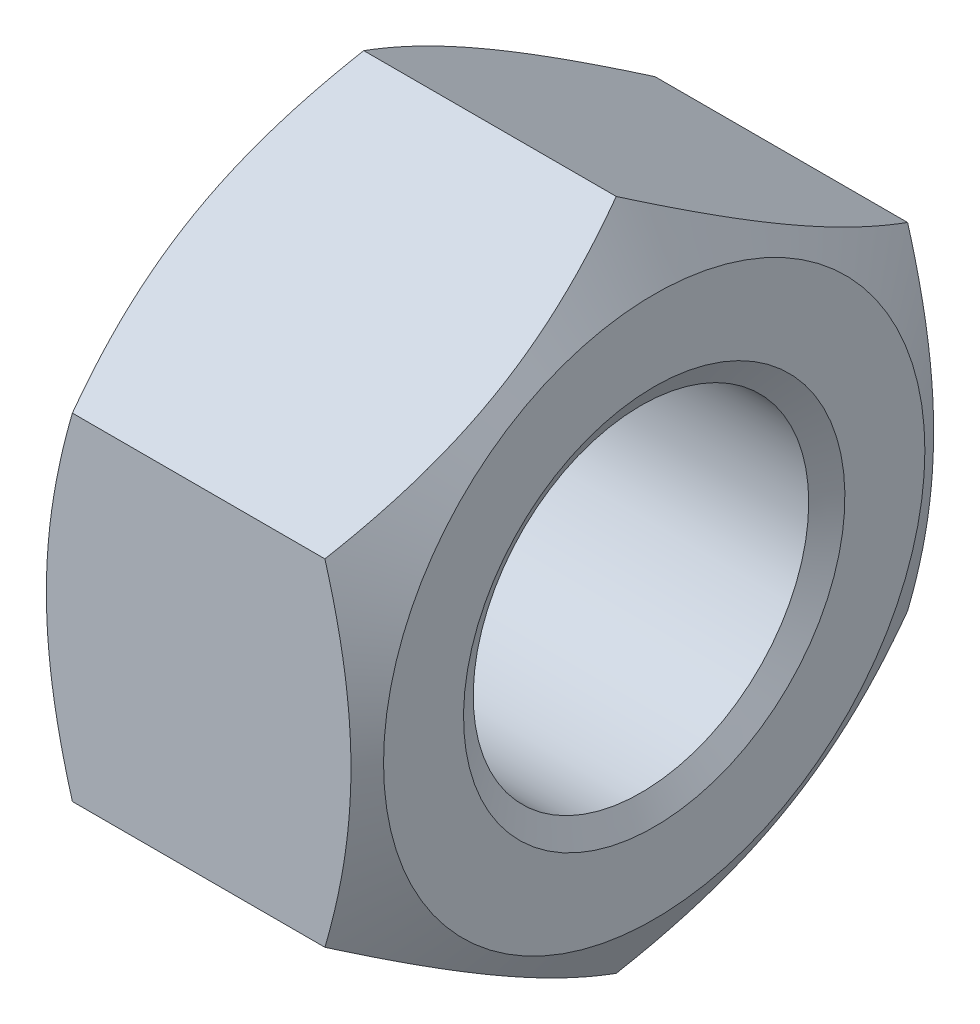
ISO-10303-21;
HEADER;
FILE_DESCRIPTION(('STEP AP214'),'2;1');
FILE_NAME('part.step','',(''),(''),'','','');
FILE_SCHEMA(('AUTOMOTIVE_DESIGN { 1 0 10303 214 1 1 1 1 }'));
ENDSEC;
DATA;
#1=APPLICATION_CONTEXT('core data for automotive mechanical design processes');
#2=APPLICATION_PROTOCOL_DEFINITION('international standard','automotive_design',2000,#1);
#3=PRODUCT_CONTEXT('',#1,'mechanical');
#4=PRODUCT('Part','Part','',(#3));
#5=PRODUCT_RELATED_PRODUCT_CATEGORY('part','',(#4));
#6=PRODUCT_DEFINITION_FORMATION('','',#4);
#7=PRODUCT_DEFINITION_CONTEXT('part definition',#1,'design');
#8=PRODUCT_DEFINITION('design','',#6,#7);
#9=PRODUCT_DEFINITION_SHAPE('','',#8);
#10=(LENGTH_UNIT() NAMED_UNIT(*) SI_UNIT(.MILLI.,.METRE.));
#11=(NAMED_UNIT(*) PLANE_ANGLE_UNIT() SI_UNIT($,.RADIAN.));
#12=(NAMED_UNIT(*) SI_UNIT($,.STERADIAN.) SOLID_ANGLE_UNIT());
#13=UNCERTAINTY_MEASURE_WITH_UNIT(LENGTH_MEASURE(1.E-05),#10,'distance_accuracy_value','');
#14=(GEOMETRIC_REPRESENTATION_CONTEXT(3) GLOBAL_UNCERTAINTY_ASSIGNED_CONTEXT((#13)) GLOBAL_UNIT_ASSIGNED_CONTEXT((#10,
#11,#12)) REPRESENTATION_CONTEXT('',''));
#15=CARTESIAN_POINT('',(0.,0.,0.));
#16=DIRECTION('',(0.,0.,1.));
#17=DIRECTION('',(1.,0.,0.));
#18=AXIS2_PLACEMENT_3D('',#15,#16,#17);
#19=CARTESIAN_POINT('',(0.,-15.8771324027147,27.5));
#20=DIRECTION('',(0.,0.,1.));
#21=DIRECTION('',(1.,0.,0.));
#22=AXIS2_PLACEMENT_3D('',#19,#20,#21);
#23=PLANE('',#22);
#24=CARTESIAN_POINT('',(27.4179660081602,15.8771324283283,27.4999999634062));
#25=CARTESIAN_POINT('',(27.6194275084082,15.1791897354773,27.4999999868555));
#26=CARTESIAN_POINT('',(27.8117467023488,14.4785246937009,27.4999999964772));
#27=CARTESIAN_POINT('',(28.1755593037495,13.0715761437403,27.500000003524));
#28=CARTESIAN_POINT('',(28.3470458616822,12.3652908685772,27.5000000009452));
#29=CARTESIAN_POINT('',(28.6668913975676,10.9457218913568,27.4999999990526));
#30=CARTESIAN_POINT('',(28.8151951481019,10.232425654135,27.4999999997464));
#31=CARTESIAN_POINT('',(29.0854802550406,8.80090717764845,27.5000000002536));
#32=CARTESIAN_POINT('',(29.207464233653,8.08268543646892,27.5000000000672));
#33=CARTESIAN_POINT('',(29.4199317976802,6.65967402289102,27.4999999999345));
#34=CARTESIAN_POINT('',(29.5111180260964,5.95498989794372,27.4999999999825));
#35=CARTESIAN_POINT('',(29.6640153971568,4.54239286358087,27.5000000000176));
#36=CARTESIAN_POINT('',(29.7257259723969,3.83447989227508,27.5000000000047));
#37=CARTESIAN_POINT('',(29.8181138792253,2.41746490997051,27.4999999999953));
#38=CARTESIAN_POINT('',(29.8488280858768,1.7083653194658,27.4999999999988));
#39=CARTESIAN_POINT('',(29.8785627618416,0.289511919389594,27.5000000000013));
#40=CARTESIAN_POINT('',(29.8775842106332,-0.420241869285694,27.5000000000003));
#41=CARTESIAN_POINT('',(29.8461478799588,-1.74712024493427,27.4999999999997));
#42=CARTESIAN_POINT('',(29.8195234828763,-2.36433936899782,27.4999999999999));
#43=CARTESIAN_POINT('',(29.7428123234216,-3.59730406349075,27.5000000000001));
#44=CARTESIAN_POINT('',(29.6927258972036,-4.21304965490526,27.5));
#45=CARTESIAN_POINT('',(29.5699586722332,-5.44283979190164,27.5));
#46=CARTESIAN_POINT('',(29.497257444049,-6.05688229090443,27.5));
#47=CARTESIAN_POINT('',(29.3305472184603,-7.28202723333915,27.5));
#48=CARTESIAN_POINT('',(29.2365383113021,-7.89312968921211,27.5));
#49=CARTESIAN_POINT('',(28.92013755515,-9.74830556503261,27.5));
#50=CARTESIAN_POINT('',(28.6661807556437,-10.9871082925873,27.5));
#51=CARTESIAN_POINT('',(28.2338320997686,-12.8316322307271,27.5));
#52=CARTESIAN_POINT('',(28.0813025364575,-13.4436650194657,27.5));
#53=CARTESIAN_POINT('',(27.7608018286029,-14.663497402922,27.5));
#54=CARTESIAN_POINT('',(27.592835035917,-15.2712981390231,27.5));
#55=CARTESIAN_POINT('',(27.4179660648567,-15.8771323149189,27.5));
#56=B_SPLINE_CURVE_WITH_KNOTS('',3,(#24,#25,#26,#27,#28,#29,#30,#31,#32,#33,#34,#35,#36,#37,#38,
#39,#40,#41,#42,#43,#44,#45,#46,#47,#48,#49,#50,#51,#52,#53,#54,#55),.UNSPECIFIED.,.F.,.F.,(4,2,
2,2,2,2,2,2,2,2,2,2,2,2,2,4),(0.,2.17936806465427,4.35945075182535,6.544650308965,
8.72963205660447,10.8607301252716,12.9918692157573,15.1204699812189,17.2490049614141,
19.1019367721466,20.9548420356662,22.8094260349125,24.6640021794187,28.4548418005175,
30.346959942782,32.2385463109677),.UNSPECIFIED.);
#57=CARTESIAN_POINT('',(27.4179660522055,15.8771324247,27.4999999619204));
#58=VERTEX_POINT('',#57);
#59=CARTESIAN_POINT('',(27.4179660522055,-15.8771323587441,27.5));
#60=VERTEX_POINT('',#59);
#61=EDGE_CURVE('E93',#58,#60,#56,.T.);
#62=ORIENTED_EDGE('',*,*,#61,.F.);
#63=DIRECTION('',(1.,0.,0.));
#64=VECTOR('',#63,1.);
#65=CARTESIAN_POINT('',(0.,15.8771324027147,27.5));
#66=LINE('',#65,#64);
#67=CARTESIAN_POINT('',(3.58203394779451,15.8771323587441,27.5));
#68=VERTEX_POINT('',#67);
#69=EDGE_CURVE('E81',#68,#58,#66,.T.);
#70=ORIENTED_EDGE('',*,*,#69,.F.);
#71=CARTESIAN_POINT('',(3.58203393454841,-15.877132314933,27.5000000009148));
#72=CARTESIAN_POINT('',(3.38057245064237,-15.1791896202409,27.5000000003286));
#73=CARTESIAN_POINT('',(3.1882532644499,-14.4785245789921,27.5000000000881));
#74=CARTESIAN_POINT('',(2.82444067092273,-13.0715760320937,27.4999999999119));
#75=CARTESIAN_POINT('',(2.65295411311634,-12.3652907594648,27.4999999999764));
#76=CARTESIAN_POINT('',(2.33310857946851,-10.9457217866933,27.5000000000237));
#77=CARTESIAN_POINT('',(2.18480483105407,-10.2324255513841,27.5000000000064));
#78=CARTESIAN_POINT('',(1.91451972777195,-8.80090707897427,27.4999999999937));
#79=CARTESIAN_POINT('',(1.79253575069461,-8.08268533995929,27.4999999999983));
#80=CARTESIAN_POINT('',(1.58006818972156,-6.65967393039791,27.5000000000017));
#81=CARTESIAN_POINT('',(1.48888196283376,-5.95498980730033,27.5000000000005));
#82=CARTESIAN_POINT('',(1.33598459469598,-4.54239277668329,27.4999999999996));
#83=CARTESIAN_POINT('',(1.27427402085115,-3.83447980727345,27.4999999999999));
#84=CARTESIAN_POINT('',(1.18188611669518,-2.41746482886599,27.5000000000001));
#85=CARTESIAN_POINT('',(1.15117191131885,-1.70836524036248,27.5000000000001));
#86=CARTESIAN_POINT('',(1.12143723773225,-0.289511844355731,27.5));
#87=CARTESIAN_POINT('',(1.12241579004308,0.420241942251311,27.5));
#88=CARTESIAN_POINT('',(1.1538521225696,1.74712031296546,27.5));
#89=CARTESIAN_POINT('',(1.18047652038604,2.36433943416893,27.5));
#90=CARTESIAN_POINT('',(1.25718768106891,3.59730412292969,27.5));
#91=CARTESIAN_POINT('',(1.30727410778141,4.21304971147209,27.5));
#92=CARTESIAN_POINT('',(1.43004133350459,5.4428398427412,27.5));
#93=CARTESIAN_POINT('',(1.50274256194777,6.05688233888876,27.5));
#94=CARTESIAN_POINT('',(1.66945278782675,7.282027275625,27.5));
#95=CARTESIAN_POINT('',(1.76346169501619,7.89312972865473,27.5));
#96=CARTESIAN_POINT('',(2.07986245086802,9.74830559542641,27.5));
#97=CARTESIAN_POINT('',(2.33381924967726,10.9871083168149,27.5));
#98=CARTESIAN_POINT('',(2.76616790394463,12.8316322458051,27.5));
#99=CARTESIAN_POINT('',(2.91869746662251,13.4436650314982,27.5));
#100=CARTESIAN_POINT('',(3.23919817305076,14.6634974089069,27.5));
#101=CARTESIAN_POINT('',(3.40716496494364,15.271298142006,27.5));
#102=CARTESIAN_POINT('',(3.58203393514328,15.8771323149189,27.5));
#103=B_SPLINE_CURVE_WITH_KNOTS('',3,(#71,#72,#73,#74,#75,#76,#77,#78,#79,#80,#81,#82,#83,#84,
#85,#86,#87,#88,#89,#90,#91,#92,#93,#94,#95,#96,#97,#98,#99,#100,#101,#102),.UNSPECIFIED.,.F.,
.F.,(4,2,2,2,2,2,2,2,2,2,2,2,2,2,2,4),(0.,2.17936805698533,4.35945073682356,6.54465028696748,
8.72963202747067,10.8607300900349,12.9918691744982,15.1204699337997,17.2490049078014,
19.1019367100634,20.9548419651223,22.8094259559604,24.6640020920554,28.4548416946616,
30.3469598276036,32.2385461864773),.UNSPECIFIED.);
#104=CARTESIAN_POINT('',(3.58203396510623,-15.8771323947153,27.5000000138555));
#105=VERTEX_POINT('',#104);
#106=EDGE_CURVE('E251',#105,#68,#103,.T.);
#107=ORIENTED_EDGE('',*,*,#106,.F.);
#108=DIRECTION('',(1.,0.,0.));
#109=VECTOR('',#108,1.);
#110=CARTESIAN_POINT('',(0.,-15.8771324027147,27.5000000000001));
#111=LINE('',#110,#109);
#112=EDGE_CURVE('E96',#60,#105,#111,.F.);
#113=ORIENTED_EDGE('',*,*,#112,.F.);
#114=EDGE_LOOP('',(#62,#70,#107,#113));
#115=FACE_BOUND('',#114,.T.);
#116=ADVANCED_FACE('F17',(#115),#23,.T.);
#117=CARTESIAN_POINT('',(0.,15.8771324027147,27.5));
#118=DIRECTION('',(0.,0.866025403784438,0.5));
#119=DIRECTION('',(0.,-0.5,0.866025403784438));
#120=AXIS2_PLACEMENT_3D('',#117,#118,#119);
#121=PLANE('',#120);
#122=CARTESIAN_POINT('',(27.4179660654514,31.7542647623309,7.64781265684022E-08));
#123=CARTESIAN_POINT('',(27.6194275493575,31.4052934144773,0.604436180174209));
#124=CARTESIAN_POINT('',(27.81174673555,31.0549608936446,1.21122990531906));
#125=CARTESIAN_POINT('',(28.1755593290772,30.3514866200429,2.42968308866265));
#126=CARTESIAN_POINT('',(28.3470458868836,29.9983439837842,3.0413440771103));
#127=CARTESIAN_POINT('',(28.6668914205314,29.2885594974395,4.27072686997828));
#128=CARTESIAN_POINT('',(28.8151951689458,28.9319113797698,4.8884595301712));
#129=CARTESIAN_POINT('',(29.085480272228,28.2161521435539,6.12819089325847));
#130=CARTESIAN_POINT('',(29.2074642493053,27.8570412740505,6.75018916479802));
#131=CARTESIAN_POINT('',(29.4199318102784,27.1455355692726,7.98255319535495));
#132=CARTESIAN_POINT('',(29.5111180371662,26.7931935077228,8.59282754760042));
#133=CARTESIAN_POINT('',(29.664015405304,26.0868949924135,9.81617246142482));
#134=CARTESIAN_POINT('',(29.7257259791488,25.7329385077089,10.4292430766024));
#135=CARTESIAN_POINT('',(29.8181138833048,25.0244310185053,11.6564140454464));
#136=CARTESIAN_POINT('',(29.8488280886812,24.6698812242535,12.2705123029035));
#137=CARTESIAN_POINT('',(29.8785627622678,23.9604545262501,13.4992753880912));
#138=CARTESIAN_POINT('',(29.8775842099569,23.6055776329466,14.1139401977251));
#139=CARTESIAN_POINT('',(29.8461478774304,22.9421384475895,15.2630505744957));
#140=CARTESIAN_POINT('',(29.819523479614,22.6335288869877,15.7975780131594));
#141=CARTESIAN_POINT('',(29.7428123189311,22.0170465426073,16.8653567555954));
#142=CARTESIAN_POINT('',(29.6927258922186,21.7091737483361,17.3986080775413));
#143=CARTESIAN_POINT('',(29.5699586664954,21.0942786827016,18.4636375725438));
#144=CARTESIAN_POINT('',(29.4972574380523,20.7872574346278,18.9954139732108));
#145=CARTESIAN_POINT('',(29.3305472121733,20.1746849662596,20.0564206117423));
#146=CARTESIAN_POINT('',(29.2365383049838,19.8691337397448,20.5856508603811));
#147=CARTESIAN_POINT('',(28.920137549132,18.9415458063589,22.1922802894932));
#148=CARTESIAN_POINT('',(28.6661807503228,18.3221444456646,23.2651149164929));
#149=CARTESIAN_POINT('',(28.2338320960554,17.3998824811695,24.8625194968868));
#150=CARTESIAN_POINT('',(28.0813025333775,17.0938660883229,25.392555437246));
#151=CARTESIAN_POINT('',(27.7608018269492,16.4839498996186,26.4489612644407));
#152=CARTESIAN_POINT('',(27.5928350350564,16.180049533069,26.9753321397433));
#153=CARTESIAN_POINT('',(27.4179660648567,15.8771324466126,27.4999999239667));
#154=B_SPLINE_CURVE_WITH_KNOTS('',3,(#122,#123,#124,#125,#126,#127,#128,#129,#130,#131,#132,
#133,#134,#135,#136,#137,#138,#139,#140,#141,#142,#143,#144,#145,#146,#147,#148,#149,#150,#151,
#152,#153),.UNSPECIFIED.,.F.,.F.,(4,2,2,2,2,2,2,2,2,2,2,2,2,2,2,4),(0.,2.17936805698536,
4.35945073682362,6.54465028696757,8.72963202747079,10.860730090035,12.9918691744984,
15.1204699337999,17.2490049078017,19.1019367100637,20.9548419651226,22.8094259559607,
24.6640020920558,28.4548416946621,30.3469598276042,32.2385461864779),.UNSPECIFIED.);
#155=CARTESIAN_POINT('',(27.4179660348939,31.7542648134287,1.38552432295039E-08));
#156=VERTEX_POINT('',#155);
#157=EDGE_CURVE('E21',#156,#58,#154,.T.);
#158=ORIENTED_EDGE('',*,*,#157,.F.);
#159=DIRECTION('',(1.,0.,0.));
#160=VECTOR('',#159,1.);
#161=CARTESIAN_POINT('',(0.,31.7542648054294,0.));
#162=LINE('',#161,#160);
#163=CARTESIAN_POINT('',(3.58203394779456,31.7542647834442,3.80794916597865E-08));
#164=VERTEX_POINT('',#163);
#165=EDGE_CURVE('E74',#164,#156,#162,.T.);
#166=ORIENTED_EDGE('',*,*,#165,.F.);
#167=CARTESIAN_POINT('',(3.5820339918398,15.8771323582166,27.5000000038852));
#168=CARTESIAN_POINT('',(3.38057249159183,16.2261037249498,26.8955639132152));
#169=CARTESIAN_POINT('',(3.18825329765123,16.5764362541707,26.2887701923039));
#170=CARTESIAN_POINT('',(2.82444069625047,17.2799105352538,25.0703170097438));
#171=CARTESIAN_POINT('',(2.65295413831784,17.633053170602,24.4586560178442));
#172=CARTESIAN_POINT('',(2.33310860243245,18.3428376575731,23.2292732202008));
#173=CARTESIAN_POINT('',(2.18480485189812,18.6994857767848,22.6115405586898));
#174=CARTESIAN_POINT('',(1.91451974495939,19.4152450154674,21.3718091923192));
#175=CARTESIAN_POINT('',(1.79253576634696,19.7743558858957,20.7498109188142));
#176=CARTESIAN_POINT('',(1.58006820231984,20.4858615925698,19.5174468847142));
#177=CARTESIAN_POINT('',(1.48888197390357,20.838203655085,18.9071725308903));
#178=CARTESIAN_POINT('',(1.3359846028432,21.5445021722968,17.683827613839));
#179=CARTESIAN_POINT('',(1.27427402760312,21.8984586579386,17.0707569970132));
#180=CARTESIAN_POINT('',(1.18188612077472,22.6069661490827,15.8435860247896));
#181=CARTESIAN_POINT('',(1.15117191412315,22.9615159443381,15.2294877656011));
#182=CARTESIAN_POINT('',(1.1214372381584,23.6709426443783,14.0007246768905));
#183=CARTESIAN_POINT('',(1.12241578936679,24.0258195387152,13.3860598654649));
#184=CARTESIAN_POINT('',(1.15385212004116,24.6892587265389,12.2369494844207));
#185=CARTESIAN_POINT('',(1.18047651712373,24.9978682885709,11.7024220432802));
#186=CARTESIAN_POINT('',(1.25718767657839,25.6143506358175,10.63464329588));
#187=CARTESIAN_POINT('',(1.30727410279644,25.9222234315247,10.1013919714468));
#188=CARTESIAN_POINT('',(1.43004132776677,26.5371185000229,9.03636247148429));
#189=CARTESIAN_POINT('',(1.50274255595104,26.8441397495243,8.50458606834458));
#190=CARTESIAN_POINT('',(1.66945278153977,27.4567122207417,7.44357942487806));
#191=CARTESIAN_POINT('',(1.76346168869789,27.7622634486782,6.914349173777));
#192=CARTESIAN_POINT('',(2.07986244485003,28.6898513865885,5.30771973682834));
#193=CARTESIAN_POINT('',(2.33381924435636,29.3092527503659,4.23488510448851));
#194=CARTESIAN_POINT('',(2.76616790023151,30.2315147194358,2.63748051617083));
#195=CARTESIAN_POINT('',(2.91869746354258,30.5375311138051,2.10744457317415));
#196=CARTESIAN_POINT('',(3.23919817139718,31.1474473055333,1.0510387407421));
#197=CARTESIAN_POINT('',(3.40716496408313,31.4513476735838,0.524667862839625));
#198=CARTESIAN_POINT('',(3.58203393514341,31.7542647615318,7.6032986374132E-08));
#199=B_SPLINE_CURVE_WITH_KNOTS('',3,(#167,#168,#169,#170,#171,#172,#173,#174,#175,#176,#177,
#178,#179,#180,#181,#182,#183,#184,#185,#186,#187,#188,#189,#190,#191,#192,#193,#194,#195,#196,
#197,#198),.UNSPECIFIED.,.F.,.F.,(4,2,2,2,2,2,2,2,2,2,2,2,2,2,2,4),(0.,2.17936806465428,
4.35945075182536,6.54465030896501,8.72963205660449,10.8607301252716,12.9918692157573,
15.1204699812189,17.2490049614141,19.1019367721467,20.9548420356664,22.8094260349127,
24.664002179419,28.454841800518,30.3469599427825,32.2385463109683),.UNSPECIFIED.);
#200=EDGE_CURVE('E84',#68,#164,#199,.T.);
#201=ORIENTED_EDGE('',*,*,#200,.F.);
#202=ORIENTED_EDGE('',*,*,#69,.T.);
#203=EDGE_LOOP('',(#158,#166,#201,#202));
#204=FACE_BOUND('',#203,.T.);
#205=ADVANCED_FACE('F83',(#204),#121,.T.);
#206=CARTESIAN_POINT('',(0.,31.7542648054294,0.));
#207=DIRECTION('',(0.,0.866025403784439,-0.499999999999999));
#208=DIRECTION('',(0.,0.499999999999999,0.866025403784439));
#209=AXIS2_PLACEMENT_3D('',#206,#207,#208);
#210=PLANE('',#209);
#211=CARTESIAN_POINT('',(27.4179660081602,15.8771323582167,-27.5000000038851));
#212=CARTESIAN_POINT('',(27.6194275084135,16.2261037249591,-26.8955639131991));
#213=CARTESIAN_POINT('',(27.811746702359,16.5764362541893,-26.2887701922717));
#214=CARTESIAN_POINT('',(28.1755593037683,17.2799105352911,-25.0703170096791));
#215=CARTESIAN_POINT('',(28.3470458617046,17.6330531706488,-24.4586560177632));
#216=CARTESIAN_POINT('',(28.6668913975964,18.3428376576401,-23.2292732200847));
#217=CARTESIAN_POINT('',(28.8151951481335,18.6994857768627,-22.611540558555));
#218=CARTESIAN_POINT('',(29.085480255076,19.415245015567,-21.3718091921468));
#219=CARTESIAN_POINT('',(29.2074642336893,19.7743558860062,-20.7498109186229));
#220=CARTESIAN_POINT('',(29.4199317977104,20.4858615926819,-19.5174468845201));
#221=CARTESIAN_POINT('',(29.5111180261213,20.8382036551876,-18.9071725307125));
#222=CARTESIAN_POINT('',(29.6640153971723,21.5445021723803,-17.6838276136945));
#223=CARTESIAN_POINT('',(29.7257259724084,21.8984586580123,-17.0707569968855));
#224=CARTESIAN_POINT('',(29.8181138792303,22.6069661491359,-15.8435860246975));
#225=CARTESIAN_POINT('',(29.8488280858795,22.9615159443804,-15.2294877655277));
#226=CARTESIAN_POINT('',(29.8785627618416,23.6709426443992,-14.0007246768542));
#227=CARTESIAN_POINT('',(29.8775842106328,24.0258195387255,-13.3860598654471));
#228=CARTESIAN_POINT('',(29.8461478798447,24.6892587289455,-12.2369494802524));
#229=CARTESIAN_POINT('',(29.8195234824609,24.9978682933819,-11.7024220349472));
#230=CARTESIAN_POINT('',(29.7428123220431,25.6143506454229,-10.634643279243));
#231=CARTESIAN_POINT('',(29.6927258951631,25.9222234435199,-10.1013919506704));
#232=CARTESIAN_POINT('',(29.5699586685323,26.5371185167829,-9.03636244245515));
#233=CARTESIAN_POINT('',(29.4972574393488,26.8441397686592,-8.50458603520204));
#234=CARTESIAN_POINT('',(29.3305472114606,27.4567122445965,-7.44357938356041));
#235=CARTESIAN_POINT('',(29.2365383030024,27.762263474878,-6.91434912839763));
#236=CARTESIAN_POINT('',(28.9201375424465,28.689851420018,-5.30771967892674));
#237=CARTESIAN_POINT('',(28.6661807394023,29.309252788627,-4.23488503821813));
#238=CARTESIAN_POINT('',(28.2338320776459,30.231514764818,-2.63748043756653));
#239=CARTESIAN_POINT('',(28.0813025122846,30.5375311615314,-2.10744449050974));
#240=CARTESIAN_POINT('',(27.7608018001738,31.1474473579135,-1.05103865001673));
#241=CARTESIAN_POINT('',(27.5928350052822,31.451347728274,-0.524667768113368));
#242=CARTESIAN_POINT('',(27.4179660319556,31.7542648185179,2.26700227273751E-08));
#243=B_SPLINE_CURVE_WITH_KNOTS('',3,(#211,#212,#213,#214,#215,#216,#217,#218,#219,#220,#221,
#222,#223,#224,#225,#226,#227,#228,#229,#230,#231,#232,#233,#234,#235,#236,#237,#238,#239,#240,
#241,#242),.UNSPECIFIED.,.F.,.F.,(4,2,2,2,2,2,2,2,2,2,2,2,2,2,2,4),(0.,2.17936806471199,
4.3594507519407,6.54465030914538,8.72963205685002,10.8607301254588,12.9918692158854,
15.1204699812817,17.2490049614141,19.1019367865879,20.9548420645509,22.8094260782914,
24.6640022372911,28.4548418888708,30.3469600462686,32.2385464295737),.UNSPECIFIED.);
#244=CARTESIAN_POINT('',(27.4179660522055,15.8771323587441,-27.5));
#245=VERTEX_POINT('',#244);
#246=EDGE_CURVE('E95',#245,#156,#243,.T.);
#247=ORIENTED_EDGE('',*,*,#246,.F.);
#248=DIRECTION('',(-1.,0.,0.));
#249=VECTOR('',#248,1.);
#250=CARTESIAN_POINT('',(0.,15.8771324027148,-27.5));
#251=LINE('',#250,#249);
#252=CARTESIAN_POINT('',(3.5820339477945,15.8771324247001,-27.4999999619203));
#253=VERTEX_POINT('',#252);
#254=EDGE_CURVE('E235',#253,#245,#251,.F.);
#255=ORIENTED_EDGE('',*,*,#254,.F.);
#256=CARTESIAN_POINT('',(3.58203399183955,31.7542647865449,4.04785833233103E-08));
#257=CARTESIAN_POINT('',(3.38057249159166,31.405293460427,-0.604436073640702));
#258=CARTESIAN_POINT('',(3.18825329765109,31.0549609478714,-1.21122980417366));
#259=CARTESIAN_POINT('',(2.82444069625035,30.3514866789939,-2.42968299378062));
#260=CARTESIAN_POINT('',(2.65295413831773,29.998344039179,-3.04134398310135));
#261=CARTESIAN_POINT('',(2.33310860243234,29.2885595489298,-4.27072677885214));
#262=CARTESIAN_POINT('',(2.18480485189803,28.9319114309197,-4.88845944105692));
#263=CARTESIAN_POINT('',(1.91451974495931,28.2161521931157,-6.12819080793473));
#264=CARTESIAN_POINT('',(1.79253576634689,27.8570413223645,-6.75018908125326));
#265=CARTESIAN_POINT('',(1.58006820231978,27.1455356154607,-7.98255311522057));
#266=CARTESIAN_POINT('',(1.48888197390352,26.7931935530286,-8.59282746909252));
#267=CARTESIAN_POINT('',(1.33598460284316,26.0868950358775,-9.81617238617885));
#268=CARTESIAN_POINT('',(1.27427402760309,25.7329385502135,-10.4292430029918));
#269=CARTESIAN_POINT('',(1.1818861207747,25.0244310590531,-11.656413975206));
#270=CARTESIAN_POINT('',(1.15117191412314,24.6698812638037,-12.2705122343979));
#271=CARTESIAN_POINT('',(1.12143723815839,23.9604545637678,-13.499275323111));
#272=CARTESIAN_POINT('',(1.12241578936679,23.6055776694294,-14.1139401345356));
#273=CARTESIAN_POINT('',(1.15385212004117,22.9421384816046,-15.2630505155792));
#274=CARTESIAN_POINT('',(1.18047651712373,22.633528919573,-15.7975779567199));
#275=CARTESIAN_POINT('',(1.2571876765784,22.0170465723267,-16.8653567041202));
#276=CARTESIAN_POINT('',(1.30727410279645,21.7091737766194,-17.3986080285534));
#277=CARTESIAN_POINT('',(1.43004132776678,21.0942787081212,-18.4636375285157));
#278=CARTESIAN_POINT('',(1.50274255595104,20.7872574586198,-18.9954139316554));
#279=CARTESIAN_POINT('',(1.66945278153976,20.1746849874024,-20.0564205751219));
#280=CARTESIAN_POINT('',(1.76346168869788,19.869133759466,-20.585650826223));
#281=CARTESIAN_POINT('',(2.07986244484999,18.9415458215557,-22.1922802631715));
#282=CARTESIAN_POINT('',(2.33381924435632,18.3221444577784,-23.2651148955113));
#283=CARTESIAN_POINT('',(2.76616790023143,17.3998824887085,-24.8625194838289));
#284=CARTESIAN_POINT('',(2.91869746354249,17.0938660943392,-25.3925554268256));
#285=CARTESIAN_POINT('',(3.23919817139707,16.4839499026111,-26.4489612592576));
#286=CARTESIAN_POINT('',(3.407164964083,16.1800495345605,-26.97533213716));
#287=CARTESIAN_POINT('',(3.58203393514327,15.8771324466126,-27.4999999239666));
#288=B_SPLINE_CURVE_WITH_KNOTS('',3,(#256,#257,#258,#259,#260,#261,#262,#263,#264,#265,#266,
#267,#268,#269,#270,#271,#272,#273,#274,#275,#276,#277,#278,#279,#280,#281,#282,#283,#284,#285,
#286,#287),.UNSPECIFIED.,.F.,.F.,(4,2,2,2,2,2,2,2,2,2,2,2,2,2,2,4),(0.,2.17936806465424,
4.35945075182529,6.54465030896492,8.72963205660436,10.8607301252715,12.9918692157571,
15.1204699812187,17.2490049614139,19.1019367721463,20.954842035666,22.8094260349122,
24.6640021794184,28.4548418005172,30.3469599427816,32.2385463109673),.UNSPECIFIED.);
#289=EDGE_CURVE('E171',#164,#253,#288,.T.);
#290=ORIENTED_EDGE('',*,*,#289,.F.);
#291=ORIENTED_EDGE('',*,*,#165,.T.);
#292=EDGE_LOOP('',(#247,#255,#290,#291));
#293=FACE_BOUND('',#292,.T.);
#294=ADVANCED_FACE('F181',(#293),#210,.T.);
#295=CARTESIAN_POINT('',(0.,15.8771324027148,-27.5));
#296=DIRECTION('',(0.,0.,-1.));
#297=DIRECTION('',(-1.,0.,0.));
#298=AXIS2_PLACEMENT_3D('',#295,#296,#297);
#299=PLANE('',#298);
#300=CARTESIAN_POINT('',(27.4179660081603,-15.8771324283283,-27.4999999634061));
#301=CARTESIAN_POINT('',(27.6194275084082,-15.1791897354773,-27.4999999868554));
#302=CARTESIAN_POINT('',(27.8117467023488,-14.4785246937008,-27.4999999964771));
#303=CARTESIAN_POINT('',(28.1755593037496,-13.0715761437403,-27.500000003524));
#304=CARTESIAN_POINT('',(28.3470458616822,-12.3652908685772,-27.5000000009452));
#305=CARTESIAN_POINT('',(28.6668913975676,-10.9457218913568,-27.4999999990525));
#306=CARTESIAN_POINT('',(28.8151951481019,-10.232425654135,-27.4999999997463));
#307=CARTESIAN_POINT('',(29.0854802550406,-8.80090717764844,-27.5000000002536));
#308=CARTESIAN_POINT('',(29.2074642336531,-8.08268543646891,-27.5000000000671));
#309=CARTESIAN_POINT('',(29.4199317976802,-6.65967402289102,-27.4999999999345));
#310=CARTESIAN_POINT('',(29.5111180260965,-5.95498989794372,-27.4999999999824));
#311=CARTESIAN_POINT('',(29.6640153971568,-4.54239286358087,-27.5000000000175));
#312=CARTESIAN_POINT('',(29.7257259723969,-3.83447989227508,-27.5000000000047));
#313=CARTESIAN_POINT('',(29.8181138792253,-2.41746490997052,-27.4999999999953));
#314=CARTESIAN_POINT('',(29.8488280858769,-1.7083653194658,-27.4999999999987));
#315=CARTESIAN_POINT('',(29.8785627618416,-0.289511919389606,-27.5000000000012));
#316=CARTESIAN_POINT('',(29.8775842106332,0.420241869285681,-27.5000000000003));
#317=CARTESIAN_POINT('',(29.8461478799589,1.74712024493426,-27.4999999999997));
#318=CARTESIAN_POINT('',(29.8195234828763,2.36433936899781,-27.4999999999999));
#319=CARTESIAN_POINT('',(29.7428123234216,3.59730406349076,-27.5));
#320=CARTESIAN_POINT('',(29.6927258972036,4.21304965490527,-27.5));
#321=CARTESIAN_POINT('',(29.5699586722333,5.44283979190165,-27.4999999999999));
#322=CARTESIAN_POINT('',(29.497257444049,6.05688229090445,-27.5));
#323=CARTESIAN_POINT('',(29.3305472184603,7.28202723333917,-27.5));
#324=CARTESIAN_POINT('',(29.2365383113022,7.89312968921214,-27.5));
#325=CARTESIAN_POINT('',(28.92013755515,9.74830556503264,-27.5));
#326=CARTESIAN_POINT('',(28.6661807556437,10.9871082925873,-27.5));
#327=CARTESIAN_POINT('',(28.2338320997686,12.8316322307272,-27.5));
#328=CARTESIAN_POINT('',(28.0813025364575,13.4436650194658,-27.5));
#329=CARTESIAN_POINT('',(27.7608018286029,14.663497402922,-27.5));
#330=CARTESIAN_POINT('',(27.592835035917,15.2712981390231,-27.5));
#331=CARTESIAN_POINT('',(27.4179660648567,15.877132314919,-27.5));
#332=B_SPLINE_CURVE_WITH_KNOTS('',3,(#300,#301,#302,#303,#304,#305,#306,#307,#308,#309,#310,
#311,#312,#313,#314,#315,#316,#317,#318,#319,#320,#321,#322,#323,#324,#325,#326,#327,#328,#329,
#330,#331),.UNSPECIFIED.,.F.,.F.,(4,2,2,2,2,2,2,2,2,2,2,2,2,2,2,4),(0.,2.17936806465426,
4.35945075182534,6.54465030896499,8.72963205660445,10.8607301252716,12.9918692157572,
15.1204699812189,17.2490049614141,19.1019367721466,20.9548420356662,22.8094260349125,
24.6640021794187,28.4548418005176,30.3469599427821,32.2385463109678),.UNSPECIFIED.);
#333=CARTESIAN_POINT('',(27.4179660522055,-15.8771324246999,-27.4999999619204));
#334=VERTEX_POINT('',#333);
#335=EDGE_CURVE('E134',#334,#245,#332,.T.);
#336=ORIENTED_EDGE('',*,*,#335,.F.);
#337=DIRECTION('',(1.,0.,0.));
#338=VECTOR('',#337,1.);
#339=CARTESIAN_POINT('',(0.,-15.8771324027146,-27.5));
#340=LINE('',#339,#338);
#341=CARTESIAN_POINT('',(3.58203394779449,-15.877132358744,-27.5));
#342=VERTEX_POINT('',#341);
#343=EDGE_CURVE('E237',#342,#334,#340,.T.);
#344=ORIENTED_EDGE('',*,*,#343,.F.);
#345=CARTESIAN_POINT('',(3.58203399183978,15.8771324283284,-27.4999999634061));
#346=CARTESIAN_POINT('',(3.38057249159181,15.1791897354774,-27.4999999868554));
#347=CARTESIAN_POINT('',(3.18825329765121,14.4785246937009,-27.4999999964771));
#348=CARTESIAN_POINT('',(2.82444069625045,13.0715761437404,-27.500000003524));
#349=CARTESIAN_POINT('',(2.65295413831783,12.3652908685772,-27.5000000009452));
#350=CARTESIAN_POINT('',(2.33310860243243,10.9457218913569,-27.4999999990525));
#351=CARTESIAN_POINT('',(2.1848048518981,10.2324256541351,-27.4999999997463));
#352=CARTESIAN_POINT('',(1.91451974495937,8.80090717764853,-27.5000000002536));
#353=CARTESIAN_POINT('',(1.79253576634695,8.082685436469,-27.5000000000671));
#354=CARTESIAN_POINT('',(1.58006820231982,6.6596740228911,-27.4999999999345));
#355=CARTESIAN_POINT('',(1.48888197390355,5.9549898979438,-27.4999999999824));
#356=CARTESIAN_POINT('',(1.33598460284318,4.54239286358095,-27.5000000000175));
#357=CARTESIAN_POINT('',(1.2742740276031,3.83447989227516,-27.5000000000047));
#358=CARTESIAN_POINT('',(1.1818861207747,2.41746490997059,-27.4999999999953));
#359=CARTESIAN_POINT('',(1.15117191412313,1.70836531946588,-27.4999999999987));
#360=CARTESIAN_POINT('',(1.12143723815838,0.28951191938968,-27.5000000000012));
#361=CARTESIAN_POINT('',(1.12241578936677,-0.420241869285609,-27.5000000000003));
#362=CARTESIAN_POINT('',(1.15385212004114,-1.74712024493419,-27.4999999999997));
#363=CARTESIAN_POINT('',(1.1804765171237,-2.36433936899774,-27.4999999999999));
#364=CARTESIAN_POINT('',(1.25718767657836,-3.59730406349068,-27.5));
#365=CARTESIAN_POINT('',(1.30727410279641,-4.21304965490519,-27.5));
#366=CARTESIAN_POINT('',(1.43004132776673,-5.44283979190158,-27.4999999999999));
#367=CARTESIAN_POINT('',(1.50274255595099,-6.05688229090437,-27.5));
#368=CARTESIAN_POINT('',(1.66945278153971,-7.28202723333909,-27.5));
#369=CARTESIAN_POINT('',(1.76346168869783,-7.89312968921206,-27.5));
#370=CARTESIAN_POINT('',(2.07986244484995,-9.74830556503256,-27.5));
#371=CARTESIAN_POINT('',(2.33381924435627,-10.9871082925872,-27.5));
#372=CARTESIAN_POINT('',(2.7661679002314,-12.8316322307271,-27.5));
#373=CARTESIAN_POINT('',(2.91869746354245,-13.4436650194657,-27.5));
#374=CARTESIAN_POINT('',(3.23919817139704,-14.6634974029219,-27.5));
#375=CARTESIAN_POINT('',(3.40716496408298,-15.2712981390231,-27.5));
#376=CARTESIAN_POINT('',(3.58203393514325,-15.8771323149189,-27.5));
#377=B_SPLINE_CURVE_WITH_KNOTS('',3,(#345,#346,#347,#348,#349,#350,#351,#352,#353,#354,#355,
#356,#357,#358,#359,#360,#361,#362,#363,#364,#365,#366,#367,#368,#369,#370,#371,#372,#373,#374,
#375,#376),.UNSPECIFIED.,.F.,.F.,(4,2,2,2,2,2,2,2,2,2,2,2,2,2,2,4),(0.,2.17936806465427,
4.35945075182535,6.544650308965,8.72963205660447,10.8607301252716,12.9918692157572,
15.1204699812189,17.2490049614141,19.1019367721466,20.9548420356662,22.8094260349125,
24.6640021794188,28.4548418005176,30.3469599427821,32.2385463109678),.UNSPECIFIED.);
#378=EDGE_CURVE('E160',#253,#342,#377,.T.);
#379=ORIENTED_EDGE('',*,*,#378,.F.);
#380=ORIENTED_EDGE('',*,*,#254,.T.);
#381=EDGE_LOOP('',(#336,#344,#379,#380));
#382=FACE_BOUND('',#381,.T.);
#383=ADVANCED_FACE('F148',(#382),#299,.T.);
#384=CARTESIAN_POINT('',(0.,-15.8771324027146,-27.5));
#385=DIRECTION('',(0.,-0.866025403784438,-0.500000000000001));
#386=DIRECTION('',(0.,0.500000000000001,-0.866025403784438));
#387=AXIS2_PLACEMENT_3D('',#384,#385,#386);
#388=PLANE('',#387);
#389=CARTESIAN_POINT('',(27.4179660081602,-31.754264786545,4.0479036688482E-08));
#390=CARTESIAN_POINT('',(27.6194275084082,-31.4052934604272,-0.604436073640288));
#391=CARTESIAN_POINT('',(27.8117467023488,-31.0549609478716,-1.21122980417326));
#392=CARTESIAN_POINT('',(28.1755593037495,-30.3514866789941,-2.42968299378024));
#393=CARTESIAN_POINT('',(28.3470458616822,-29.9983440391793,-3.04134398310098));
#394=CARTESIAN_POINT('',(28.6668913975676,-29.28855954893,-4.27072677885177));
#395=CARTESIAN_POINT('',(28.8151951481019,-28.9319114309199,-4.88845944105657));
#396=CARTESIAN_POINT('',(29.0854802550406,-28.2161521931159,-6.12819080793439));
#397=CARTESIAN_POINT('',(29.2074642336531,-27.8570413223647,-6.75018908125293));
#398=CARTESIAN_POINT('',(29.4199317976802,-27.1455356154608,-7.98255311522025));
#399=CARTESIAN_POINT('',(29.5111180260964,-26.7931935530287,-8.5928274690922));
#400=CARTESIAN_POINT('',(29.6640153971568,-26.0868950358777,-9.81617238617854));
#401=CARTESIAN_POINT('',(29.7257259723969,-25.7329385502137,-10.4292430029914));
#402=CARTESIAN_POINT('',(29.8181138792253,-25.0244310590533,-11.6564139752057));
#403=CARTESIAN_POINT('',(29.8488280858769,-24.6698812638039,-12.2705122343976));
#404=CARTESIAN_POINT('',(29.8785627618416,-23.9604545637679,-13.4992753231108));
#405=CARTESIAN_POINT('',(29.8775842106332,-23.6055776694295,-14.1139401345354));
#406=CARTESIAN_POINT('',(29.8461478799589,-22.9421384816047,-15.263050515579));
#407=CARTESIAN_POINT('',(29.8195234828763,-22.6335289195731,-15.7975779567197));
#408=CARTESIAN_POINT('',(29.7428123234216,-22.0170465723267,-16.86535670412));
#409=CARTESIAN_POINT('',(29.6927258972036,-21.7091737766194,-17.3986080285532));
#410=CARTESIAN_POINT('',(29.5699586722333,-21.0942787081212,-18.4636375285156));
#411=CARTESIAN_POINT('',(29.497257444049,-20.7872574586198,-18.9954139316553));
#412=CARTESIAN_POINT('',(29.3305472184603,-20.1746849874025,-20.0564205751218));
#413=CARTESIAN_POINT('',(29.2365383113022,-19.869133759466,-20.5856508262228));
#414=CARTESIAN_POINT('',(28.92013755515,-18.9415458215557,-22.1922802631714));
#415=CARTESIAN_POINT('',(28.6661807556437,-18.3221444577784,-23.2651148955113));
#416=CARTESIAN_POINT('',(28.2338320997686,-17.3998824887084,-24.8625194838289));
#417=CARTESIAN_POINT('',(28.0813025364575,-17.0938660943391,-25.3925554268256));
#418=CARTESIAN_POINT('',(27.7608018286029,-16.483949902611,-26.4489612592576));
#419=CARTESIAN_POINT('',(27.592835035917,-16.1800495345604,-26.9753321371601));
#420=CARTESIAN_POINT('',(27.4179660648567,-15.8771324466125,-27.4999999239667));
#421=B_SPLINE_CURVE_WITH_KNOTS('',3,(#389,#390,#391,#392,#393,#394,#395,#396,#397,#398,#399,
#400,#401,#402,#403,#404,#405,#406,#407,#408,#409,#410,#411,#412,#413,#414,#415,#416,#417,#418,
#419,#420),.UNSPECIFIED.,.F.,.F.,(4,2,2,2,2,2,2,2,2,2,2,2,2,2,2,4),(0.,2.17936806465427,
4.35945075182535,6.544650308965,8.72963205660447,10.8607301252716,12.9918692157572,
15.1204699812189,17.2490049614141,19.1019367721466,20.9548420356663,22.8094260349126,
24.6640021794188,28.4548418005176,30.3469599427822,32.2385463109679),.UNSPECIFIED.);
#422=CARTESIAN_POINT('',(27.4179660522055,-31.7542647834441,3.80797045351463E-08));
#423=VERTEX_POINT('',#422);
#424=EDGE_CURVE('E99',#423,#334,#421,.T.);
#425=ORIENTED_EDGE('',*,*,#424,.F.);
#426=DIRECTION('',(1.,0.,0.));
#427=VECTOR('',#426,1.);
#428=CARTESIAN_POINT('',(0.,-31.7542648054294,0.));
#429=LINE('',#428,#427);
#430=CARTESIAN_POINT('',(3.5820339477945,-31.7542647834441,-3.80796494046962E-08));
#431=VERTEX_POINT('',#430);
#432=EDGE_CURVE('E239',#431,#423,#429,.T.);
#433=ORIENTED_EDGE('',*,*,#432,.F.);
#434=CARTESIAN_POINT('',(3.58203399183977,-15.8771323582166,-27.5000000038852));
#435=CARTESIAN_POINT('',(3.38057249159181,-16.2261037249498,-26.8955639132151));
#436=CARTESIAN_POINT('',(3.18825329765121,-16.5764362541707,-26.2887701923039));
#437=CARTESIAN_POINT('',(2.82444069625045,-17.2799105352537,-25.0703170097438));
#438=CARTESIAN_POINT('',(2.65295413831782,-17.633053170602,-24.4586560178442));
#439=CARTESIAN_POINT('',(2.33310860243243,-18.3428376575731,-23.2292732202008));
#440=CARTESIAN_POINT('',(2.1848048518981,-18.6994857767848,-22.6115405586898));
#441=CARTESIAN_POINT('',(1.91451974495937,-19.4152450154674,-21.3718091923192));
#442=CARTESIAN_POINT('',(1.79253576634694,-19.7743558858957,-20.7498109188142));
#443=CARTESIAN_POINT('',(1.58006820231982,-20.4858615925697,-19.5174468847142));
#444=CARTESIAN_POINT('',(1.48888197390355,-20.8382036550849,-18.9071725308902));
#445=CARTESIAN_POINT('',(1.33598460284318,-21.5445021722968,-17.683827613839));
#446=CARTESIAN_POINT('',(1.2742740276031,-21.8984586579385,-17.0707569970133));
#447=CARTESIAN_POINT('',(1.1818861207747,-22.6069661490827,-15.8435860247896));
#448=CARTESIAN_POINT('',(1.15117191412313,-22.961515944338,-15.2294877656011));
#449=CARTESIAN_POINT('',(1.12143723815838,-23.6709426443783,-14.0007246768905));
#450=CARTESIAN_POINT('',(1.12241578936677,-24.0258195387151,-13.386059865465));
#451=CARTESIAN_POINT('',(1.15385212004114,-24.6892587265389,-12.2369494844208));
#452=CARTESIAN_POINT('',(1.18047651712371,-24.9978682885708,-11.7024220432802));
#453=CARTESIAN_POINT('',(1.25718767657837,-25.6143506358174,-10.6346432958801));
#454=CARTESIAN_POINT('',(1.30727410279641,-25.9222234315247,-10.1013919714468));
#455=CARTESIAN_POINT('',(1.43004132776674,-26.5371185000228,-9.0363624714844));
#456=CARTESIAN_POINT('',(1.502742555951,-26.8441397495242,-8.5045860683447));
#457=CARTESIAN_POINT('',(1.66945278153972,-27.4567122207416,-7.44357942487821));
#458=CARTESIAN_POINT('',(1.76346168869784,-27.7622634486781,-6.91434917377716));
#459=CARTESIAN_POINT('',(2.07986244484996,-28.6898513865883,-5.30771973682854));
#460=CARTESIAN_POINT('',(2.33381924435629,-29.3092527503657,-4.23488510448874));
#461=CARTESIAN_POINT('',(2.76616790023142,-30.2315147194356,-2.6374805161711));
#462=CARTESIAN_POINT('',(2.91869746354248,-30.5375311138049,-2.10744457317443));
#463=CARTESIAN_POINT('',(3.23919817139707,-31.147447305533,-1.05103874074241));
#464=CARTESIAN_POINT('',(3.407164964083,-31.4513476735836,-0.524667862839944));
#465=CARTESIAN_POINT('',(3.58203393514328,-31.7542647615315,-7.60333213475135E-08));
#466=B_SPLINE_CURVE_WITH_KNOTS('',3,(#434,#435,#436,#437,#438,#439,#440,#441,#442,#443,#444,
#445,#446,#447,#448,#449,#450,#451,#452,#453,#454,#455,#456,#457,#458,#459,#460,#461,#462,#463,
#464,#465),.UNSPECIFIED.,.F.,.F.,(4,2,2,2,2,2,2,2,2,2,2,2,2,2,2,4),(0.,2.17936806465427,
4.35945075182535,6.544650308965,8.72963205660447,10.8607301252716,12.9918692157572,
15.1204699812189,17.2490049614141,19.1019367721466,20.9548420356663,22.8094260349126,
24.6640021794188,28.4548418005176,30.3469599427822,32.2385463109679),.UNSPECIFIED.);
#467=EDGE_CURVE('E41',#342,#431,#466,.T.);
#468=ORIENTED_EDGE('',*,*,#467,.F.);
#469=ORIENTED_EDGE('',*,*,#343,.T.);
#470=EDGE_LOOP('',(#425,#433,#468,#469));
#471=FACE_BOUND('',#470,.T.);
#472=ADVANCED_FACE('F145',(#471),#388,.T.);
#473=CARTESIAN_POINT('',(0.,-31.7542648054294,0.));
#474=DIRECTION('',(0.,-0.866025403784439,0.5));
#475=DIRECTION('',(0.,-0.5,-0.866025403784439));
#476=AXIS2_PLACEMENT_3D('',#473,#474,#475);
#477=PLANE('',#476);
#478=CARTESIAN_POINT('',(27.4179660081602,-15.8771323582167,27.5000000038852));
#479=CARTESIAN_POINT('',(27.6194275084082,-16.2261037249498,26.8955639132152));
#480=CARTESIAN_POINT('',(27.8117467023488,-16.5764362541707,26.2887701923039));
#481=CARTESIAN_POINT('',(28.1755593037495,-17.2799105352538,25.0703170097438));
#482=CARTESIAN_POINT('',(28.3470458616822,-17.6330531706021,24.4586560178443));
#483=CARTESIAN_POINT('',(28.6668913975675,-18.3428376575731,23.2292732202008));
#484=CARTESIAN_POINT('',(28.8151951481019,-18.6994857767849,22.6115405586898));
#485=CARTESIAN_POINT('',(29.0854802550406,-19.4152450154675,21.3718091923192));
#486=CARTESIAN_POINT('',(29.207464233653,-19.7743558858958,20.7498109188142));
#487=CARTESIAN_POINT('',(29.4199317976802,-20.4858615925698,19.5174468847142));
#488=CARTESIAN_POINT('',(29.5111180260964,-20.838203655085,18.9071725308902));
#489=CARTESIAN_POINT('',(29.6640153971568,-21.5445021722968,17.683827613839));
#490=CARTESIAN_POINT('',(29.7257259723969,-21.8984586579386,17.0707569970132));
#491=CARTESIAN_POINT('',(29.8181138792253,-22.6069661490827,15.8435860247896));
#492=CARTESIAN_POINT('',(29.8488280858768,-22.9615159443381,15.2294877656011));
#493=CARTESIAN_POINT('',(29.8785627618416,-23.6709426443783,14.0007246768905));
#494=CARTESIAN_POINT('',(29.8775842106332,-24.0258195387152,13.3860598654649));
#495=CARTESIAN_POINT('',(29.8461478799588,-24.689258726539,12.2369494844207));
#496=CARTESIAN_POINT('',(29.8195234828763,-24.9978682885709,11.7024220432802));
#497=CARTESIAN_POINT('',(29.7428123234216,-25.6143506358175,10.6346432958801));
#498=CARTESIAN_POINT('',(29.6927258972036,-25.9222234315247,10.1013919714468));
#499=CARTESIAN_POINT('',(29.5699586722332,-26.5371185000229,9.03636247148439));
#500=CARTESIAN_POINT('',(29.497257444049,-26.8441397495243,8.5045860683447));
#501=CARTESIAN_POINT('',(29.3305472184603,-27.4567122207416,7.44357942487821));
#502=CARTESIAN_POINT('',(29.2365383113021,-27.7622634486781,6.91434917377716));
#503=CARTESIAN_POINT('',(28.92013755515,-28.6898513865884,5.30771973682856));
#504=CARTESIAN_POINT('',(28.6661807556437,-29.3092527503657,4.23488510448876));
#505=CARTESIAN_POINT('',(28.2338320997686,-30.2315147194356,2.63748051617113));
#506=CARTESIAN_POINT('',(28.0813025364575,-30.5375311138049,2.10744457317447));
#507=CARTESIAN_POINT('',(27.7608018286029,-31.1474473055331,1.05103874074245));
#508=CARTESIAN_POINT('',(27.592835035917,-31.4513476735836,0.524667862839989));
#509=CARTESIAN_POINT('',(27.4179660648567,-31.7542647615316,7.60333679354617E-08));
#510=B_SPLINE_CURVE_WITH_KNOTS('',3,(#478,#479,#480,#481,#482,#483,#484,#485,#486,#487,#488,
#489,#490,#491,#492,#493,#494,#495,#496,#497,#498,#499,#500,#501,#502,#503,#504,#505,#506,#507,
#508,#509),.UNSPECIFIED.,.F.,.F.,(4,2,2,2,2,2,2,2,2,2,2,2,2,2,2,4),(0.,2.17936806465427,
4.35945075182536,6.54465030896502,8.72963205660449,10.8607301252716,12.9918692157573,
15.120469981219,17.2490049614142,19.1019367721466,20.9548420356663,22.8094260349126,
24.6640021794188,28.4548418005176,30.3469599427821,32.2385463109678),.UNSPECIFIED.);
#511=EDGE_CURVE('E98',#60,#423,#510,.T.);
#512=ORIENTED_EDGE('',*,*,#511,.F.);
#513=ORIENTED_EDGE('',*,*,#112,.T.);
#514=CARTESIAN_POINT('',(3.58203399183978,-31.754264786545,-4.04789855062981E-08));
#515=CARTESIAN_POINT('',(3.38057249158649,-31.405293460418,0.604436073656347));
#516=CARTESIAN_POINT('',(3.18825329764104,-31.0549609478531,1.21122980420546));
#517=CARTESIAN_POINT('',(2.82444069623175,-30.3514866789568,2.42968299384493));
#518=CARTESIAN_POINT('',(2.65295413829546,-29.9983440391325,3.04134398318203));
#519=CARTESIAN_POINT('',(2.33310860240357,-29.288559548863,4.27072677896786));
#520=CARTESIAN_POINT('',(2.1848048518665,-28.9319114308422,4.88845944119135));
#521=CARTESIAN_POINT('',(1.91451974492405,-28.2161521930164,6.12819080810682));
#522=CARTESIAN_POINT('',(1.79253576631066,-27.8570413222542,6.75018908144432));
#523=CARTESIAN_POINT('',(1.5800682022896,-27.1455356153488,7.98255311541442));
#524=CARTESIAN_POINT('',(1.48888197387875,-26.7931935529261,8.59282746926998));
#525=CARTESIAN_POINT('',(1.33598460282776,-26.0868950357943,9.8161723863231));
#526=CARTESIAN_POINT('',(1.27427402759163,-25.73293855014,10.4292430031192));
#527=CARTESIAN_POINT('',(1.18188612076966,-25.0244310590001,11.6564139752978));
#528=CARTESIAN_POINT('',(1.15117191412048,-24.6698812637616,12.270512234471));
#529=CARTESIAN_POINT('',(1.12143723815843,-23.9604545637471,13.499275323147));
#530=CARTESIAN_POINT('',(1.12241578936718,-23.6055776694192,14.1139401345532));
#531=CARTESIAN_POINT('',(1.15385212015529,-22.9421384791981,15.2630505197473));
#532=CARTESIAN_POINT('',(1.18047651753909,-22.633528914762,15.7975779650528));
#533=CARTESIAN_POINT('',(1.25718767795694,-22.0170465627213,16.8653567207571));
#534=CARTESIAN_POINT('',(1.30727410483697,-21.7091737646242,17.3986080493297));
#535=CARTESIAN_POINT('',(1.43004133146776,-21.0942786913612,18.463637557545));
#536=CARTESIAN_POINT('',(1.50274256065128,-20.7872574394849,18.9954139647981));
#537=CARTESIAN_POINT('',(1.66945278853942,-20.1746849635476,20.0564206164398));
#538=CARTESIAN_POINT('',(1.7634616969977,-19.869133733266,20.5856508716026));
#539=CARTESIAN_POINT('',(2.07986245755356,-18.941545788126,22.1922803210735));
#540=CARTESIAN_POINT('',(2.33381926059777,-18.3221444195169,23.2651149617821));
#541=CARTESIAN_POINT('',(2.76616792235418,-17.399882443326,24.8625195624338));
#542=CARTESIAN_POINT('',(2.91869748771555,-17.0938660466125,25.3925555094906));
#543=CARTESIAN_POINT('',(3.23919819982631,-16.4839498502304,26.4489613499837));
#544=CARTESIAN_POINT('',(3.40716499471797,-16.1800494798699,26.975332231887));
#545=CARTESIAN_POINT('',(3.58203396804455,-15.877132389626,27.5000000226704));
#546=B_SPLINE_CURVE_WITH_KNOTS('',3,(#514,#515,#516,#517,#518,#519,#520,#521,#522,#523,#524,
#525,#526,#527,#528,#529,#530,#531,#532,#533,#534,#535,#536,#537,#538,#539,#540,#541,#542,#543,
#544,#545),.UNSPECIFIED.,.F.,.F.,(4,2,2,2,2,2,2,2,2,2,2,2,2,2,2,4),(0.,2.17936806471199,
4.35945075194071,6.54465030914539,8.72963205685003,10.8607301254588,12.9918692158854,
15.1204699812818,17.2490049614141,19.101936786588,20.954842064551,22.8094260782916,
24.6640022372914,28.4548418888712,30.346960046269,32.2385464295743),.UNSPECIFIED.);
#547=EDGE_CURVE('E159',#431,#105,#546,.T.);
#548=ORIENTED_EDGE('',*,*,#547,.F.);
#549=ORIENTED_EDGE('',*,*,#432,.T.);
#550=EDGE_LOOP('',(#512,#513,#548,#549));
#551=FACE_BOUND('',#550,.T.);
#552=ADVANCED_FACE('F115',(#551),#477,.T.);
#553=CARTESIAN_POINT('',(27.3964738369718,0.,0.));
#554=DIRECTION('',(-1.,0.,0.));
#555=DIRECTION('',(0.,0.,1.));
#556=AXIS2_PLACEMENT_3D('',#553,#554,#555);
#557=CONICAL_SURFACE('',#556,31.7914903920931,1.04719755);
#558=CARTESIAN_POINT('',(31.000000003712,0.,0.));
#559=DIRECTION('',(-1.,0.,0.));
#560=DIRECTION('',(0.,0.,1.));
#561=AXIS2_PLACEMENT_3D('',#558,#559,#560);
#562=CIRCLE('',#561,25.5500000021431);
#563=CARTESIAN_POINT('',(31.000000003712,0.,25.5500000021431));
#564=VERTEX_POINT('',#563);
#565=EDGE_CURVE('E225',#564,#564,#562,.F.);
#566=ORIENTED_EDGE('',*,*,#565,.F.);
#567=EDGE_LOOP('',(#566));
#568=FACE_BOUND('',#567,.T.);
#569=ORIENTED_EDGE('',*,*,#335,.T.);
#570=ORIENTED_EDGE('',*,*,#246,.T.);
#571=ORIENTED_EDGE('',*,*,#157,.T.);
#572=ORIENTED_EDGE('',*,*,#61,.T.);
#573=ORIENTED_EDGE('',*,*,#511,.T.);
#574=ORIENTED_EDGE('',*,*,#424,.T.);
#575=EDGE_LOOP('',(#569,#570,#571,#572,#573,#574));
#576=FACE_BOUND('',#575,.T.);
#577=ADVANCED_FACE('F91',(#568,#576),#557,.T.);
#578=CARTESIAN_POINT('',(3.60352616302817,0.,0.));
#579=DIRECTION('',(1.,0.,0.));
#580=DIRECTION('',(0.,0.,-1.));
#581=AXIS2_PLACEMENT_3D('',#578,#579,#580);
#582=CONICAL_SURFACE('',#581,31.7914903920931,1.04719755);
#583=CARTESIAN_POINT('',(-3.71200596302468E-09,0.,0.));
#584=DIRECTION('',(1.,0.,0.));
#585=DIRECTION('',(0.,0.,-1.));
#586=AXIS2_PLACEMENT_3D('',#583,#584,#585);
#587=CIRCLE('',#586,25.5500000021431);
#588=CARTESIAN_POINT('',(-3.71200578875562E-09,0.,-25.5500000021431));
#589=VERTEX_POINT('',#588);
#590=EDGE_CURVE('E226',#589,#589,#587,.T.);
#591=ORIENTED_EDGE('',*,*,#590,.T.);
#592=EDGE_LOOP('',(#591));
#593=FACE_BOUND('',#592,.T.);
#594=ORIENTED_EDGE('',*,*,#467,.T.);
#595=ORIENTED_EDGE('',*,*,#547,.T.);
#596=ORIENTED_EDGE('',*,*,#106,.T.);
#597=ORIENTED_EDGE('',*,*,#200,.T.);
#598=ORIENTED_EDGE('',*,*,#289,.T.);
#599=ORIENTED_EDGE('',*,*,#378,.T.);
#600=EDGE_LOOP('',(#594,#595,#596,#597,#598,#599));
#601=FACE_BOUND('',#600,.T.);
#602=ADVANCED_FACE('F114',(#593,#601),#582,.T.);
#603=CARTESIAN_POINT('',(31.,0.,0.));
#604=DIRECTION('',(1.,0.,0.));
#605=DIRECTION('',(0.,0.,-1.));
#606=AXIS2_PLACEMENT_3D('',#603,#604,#605);
#607=PLANE('',#606);
#608=CARTESIAN_POINT('',(31.0000000012954,0.,0.));
#609=DIRECTION('',(1.,0.,0.));
#610=DIRECTION('',(0.,1.,0.));
#611=AXIS2_PLACEMENT_3D('',#608,#609,#610);
#612=CIRCLE('',#611,18.0000635087132);
#613=CARTESIAN_POINT('',(31.0000000012954,18.0000635087132,0.));
#614=VERTEX_POINT('',#613);
#615=EDGE_CURVE('E222',#614,#614,#612,.F.);
#616=ORIENTED_EDGE('',*,*,#615,.T.);
#617=EDGE_LOOP('',(#616));
#618=FACE_BOUND('',#617,.T.);
#619=ORIENTED_EDGE('',*,*,#565,.T.);
#620=EDGE_LOOP('',(#619));
#621=FACE_BOUND('',#620,.T.);
#622=ADVANCED_FACE('F211',(#618,#621),#607,.T.);
#623=CARTESIAN_POINT('',(0.,0.,0.));
#624=DIRECTION('',(1.,0.,0.));
#625=DIRECTION('',(0.,0.,-1.));
#626=AXIS2_PLACEMENT_3D('',#623,#624,#625);
#627=PLANE('',#626);
#628=CARTESIAN_POINT('',(-1.29535217188032E-09,0.,0.));
#629=DIRECTION('',(-1.,0.,0.));
#630=DIRECTION('',(0.,0.,1.));
#631=AXIS2_PLACEMENT_3D('',#628,#629,#630);
#632=CIRCLE('',#631,18.0000635087132);
#633=CARTESIAN_POINT('',(-1.29535217188032E-09,0.,18.0000635087132));
#634=VERTEX_POINT('',#633);
#635=EDGE_CURVE('E231',#634,#634,#632,.F.);
#636=ORIENTED_EDGE('',*,*,#635,.T.);
#637=EDGE_LOOP('',(#636));
#638=FACE_BOUND('',#637,.T.);
#639=ORIENTED_EDGE('',*,*,#590,.F.);
#640=EDGE_LOOP('',(#639));
#641=FACE_BOUND('',#640,.T.);
#642=ADVANCED_FACE('F208',(#638,#641),#627,.F.);
#643=CARTESIAN_POINT('',(31.0000000012954,0.,0.));
#644=DIRECTION('',(1.,0.,0.));
#645=DIRECTION('',(0.,1.,0.));
#646=AXIS2_PLACEMENT_3D('',#643,#644,#645);
#647=CONICAL_SURFACE('',#646,18.0000635087132,1.04719755);
#648=ORIENTED_EDGE('',*,*,#615,.F.);
#649=EDGE_LOOP('',(#648));
#650=FACE_BOUND('',#649,.T.);
#651=CARTESIAN_POINT('',(29.75,0.,0.));
#652=DIRECTION('',(1.,0.,0.));
#653=DIRECTION('',(0.,0.,-1.));
#654=AXIS2_PLACEMENT_3D('',#651,#652,#653);
#655=CIRCLE('',#654,15.835);
#656=CARTESIAN_POINT('',(29.75,0.,-15.835));
#657=VERTEX_POINT('',#656);
#658=EDGE_CURVE('E32',#657,#657,#655,.F.);
#659=ORIENTED_EDGE('',*,*,#658,.T.);
#660=EDGE_LOOP('',(#659));
#661=FACE_BOUND('',#660,.T.);
#662=ADVANCED_FACE('F200',(#650,#661),#647,.F.);
#663=CARTESIAN_POINT('',(-1.29535217188032E-09,0.,0.));
#664=DIRECTION('',(-1.,0.,0.));
#665=DIRECTION('',(0.,0.,1.));
#666=AXIS2_PLACEMENT_3D('',#663,#664,#665);
#667=CONICAL_SURFACE('',#666,18.0000635087132,1.04719755);
#668=ORIENTED_EDGE('',*,*,#635,.F.);
#669=EDGE_LOOP('',(#668));
#670=FACE_BOUND('',#669,.T.);
#671=CARTESIAN_POINT('',(1.25,0.,0.));
#672=DIRECTION('',(1.,0.,0.));
#673=DIRECTION('',(0.,0.,-1.));
#674=AXIS2_PLACEMENT_3D('',#671,#672,#673);
#675=CIRCLE('',#674,15.835);
#676=CARTESIAN_POINT('',(1.25,0.,-15.835));
#677=VERTEX_POINT('',#676);
#678=EDGE_CURVE('E11',#677,#677,#675,.T.);
#679=ORIENTED_EDGE('',*,*,#678,.T.);
#680=EDGE_LOOP('',(#679));
#681=FACE_BOUND('',#680,.T.);
#682=ADVANCED_FACE('F194',(#670,#681),#667,.F.);
#683=CARTESIAN_POINT('',(-59.2635300548112,0.,0.));
#684=DIRECTION('',(1.,0.,0.));
#685=DIRECTION('',(0.,0.,-1.));
#686=AXIS2_PLACEMENT_3D('',#683,#684,#685);
#687=CYLINDRICAL_SURFACE('',#686,15.835);
#688=ORIENTED_EDGE('',*,*,#678,.F.);
#689=EDGE_LOOP('',(#688));
#690=FACE_BOUND('',#689,.T.);
#691=ORIENTED_EDGE('',*,*,#658,.F.);
#692=EDGE_LOOP('',(#691));
#693=FACE_BOUND('',#692,.T.);
#694=ADVANCED_FACE('F192',(#690,#693),#687,.F.);
#695=CLOSED_SHELL('',(#116,#205,#294,#383,#472,#552,#577,#602,#622,#642,#662,#682,#694));
#696=MANIFOLD_SOLID_BREP('B1',#695);
#697=ADVANCED_BREP_SHAPE_REPRESENTATION('',(#18,#696),#14);
#698=SHAPE_DEFINITION_REPRESENTATION(#9,#697);
ENDSEC;
END-ISO-10303-21;
